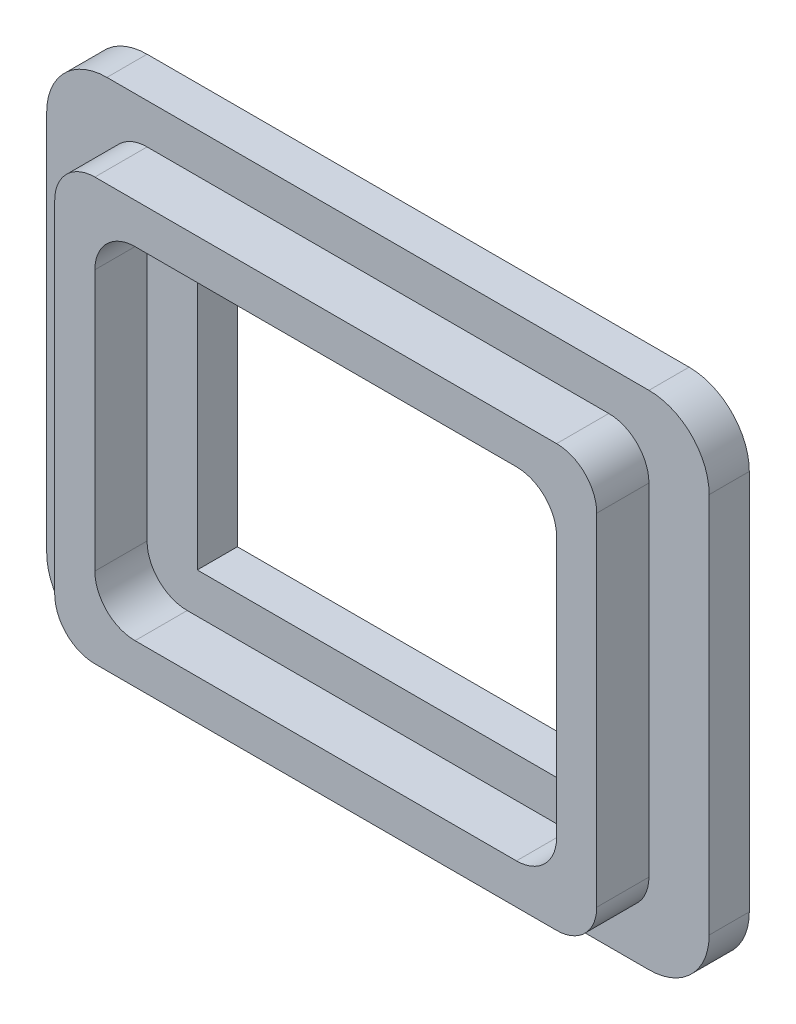
ISO-10303-21;
HEADER;
FILE_DESCRIPTION(('STEP AP214'),'2;1');
FILE_NAME('part.step','',(''),(''),'','','');
FILE_SCHEMA(('AUTOMOTIVE_DESIGN { 1 0 10303 214 1 1 1 1 }'));
ENDSEC;
DATA;
#1=APPLICATION_CONTEXT('core data for automotive mechanical design processes');
#2=APPLICATION_PROTOCOL_DEFINITION('international standard','automotive_design',2000,#1);
#3=PRODUCT_CONTEXT('',#1,'mechanical');
#4=PRODUCT('Part','Part','',(#3));
#5=PRODUCT_RELATED_PRODUCT_CATEGORY('part','',(#4));
#6=PRODUCT_DEFINITION_FORMATION('','',#4);
#7=PRODUCT_DEFINITION_CONTEXT('part definition',#1,'design');
#8=PRODUCT_DEFINITION('design','',#6,#7);
#9=PRODUCT_DEFINITION_SHAPE('','',#8);
#10=(LENGTH_UNIT() NAMED_UNIT(*) SI_UNIT(.MILLI.,.METRE.));
#11=(NAMED_UNIT(*) PLANE_ANGLE_UNIT() SI_UNIT($,.RADIAN.));
#12=(NAMED_UNIT(*) SI_UNIT($,.STERADIAN.) SOLID_ANGLE_UNIT());
#13=UNCERTAINTY_MEASURE_WITH_UNIT(LENGTH_MEASURE(1.E-05),#10,'distance_accuracy_value','');
#14=(GEOMETRIC_REPRESENTATION_CONTEXT(3) GLOBAL_UNCERTAINTY_ASSIGNED_CONTEXT((#13)) GLOBAL_UNIT_ASSIGNED_CONTEXT((#10,
#11,#12)) REPRESENTATION_CONTEXT('',''));
#15=CARTESIAN_POINT('',(0.,0.,0.));
#16=DIRECTION('',(0.,0.,1.));
#17=DIRECTION('',(1.,0.,0.));
#18=AXIS2_PLACEMENT_3D('',#15,#16,#17);
#19=CARTESIAN_POINT('',(13.5,9.5,2.));
#20=DIRECTION('',(0.,0.,-1.));
#21=DIRECTION('',(-1.,0.,0.));
#22=AXIS2_PLACEMENT_3D('',#19,#20,#21);
#23=PLANE('',#22);
#24=DIRECTION('',(0.,1.,0.));
#25=VECTOR('',#24,1.);
#26=CARTESIAN_POINT('',(11.5,6.49999999999999,2.));
#27=LINE('',#26,#25);
#28=CARTESIAN_POINT('',(11.5,-6.49999999999998,2.));
#29=VERTEX_POINT('',#28);
#30=CARTESIAN_POINT('',(11.5,6.49999999999999,2.));
#31=VERTEX_POINT('',#30);
#32=EDGE_CURVE('E264',#29,#31,#27,.T.);
#33=ORIENTED_EDGE('',*,*,#32,.T.);
#34=CARTESIAN_POINT('',(9.5,6.5,2.));
#35=DIRECTION('',(0.,0.,1.));
#36=DIRECTION('',(-1.,0.,0.));
#37=AXIS2_PLACEMENT_3D('',#34,#35,#36);
#38=CIRCLE('',#37,2.);
#39=CARTESIAN_POINT('',(9.49999999999998,8.5,2.));
#40=VERTEX_POINT('',#39);
#41=EDGE_CURVE('E254',#31,#40,#38,.T.);
#42=ORIENTED_EDGE('',*,*,#41,.T.);
#43=DIRECTION('',(-1.,0.,0.));
#44=VECTOR('',#43,1.);
#45=CARTESIAN_POINT('',(-9.49999999999999,8.5,2.));
#46=LINE('',#45,#44);
#47=CARTESIAN_POINT('',(-9.49999999999999,8.5,2.));
#48=VERTEX_POINT('',#47);
#49=EDGE_CURVE('E290',#40,#48,#46,.T.);
#50=ORIENTED_EDGE('',*,*,#49,.T.);
#51=CARTESIAN_POINT('',(-9.5,6.5,2.));
#52=DIRECTION('',(0.,0.,1.));
#53=DIRECTION('',(-1.,0.,0.));
#54=AXIS2_PLACEMENT_3D('',#51,#52,#53);
#55=CIRCLE('',#54,2.);
#56=CARTESIAN_POINT('',(-11.5,6.49999999999999,2.));
#57=VERTEX_POINT('',#56);
#58=EDGE_CURVE('E294',#48,#57,#55,.T.);
#59=ORIENTED_EDGE('',*,*,#58,.T.);
#60=DIRECTION('',(0.,-1.,0.));
#61=VECTOR('',#60,1.);
#62=CARTESIAN_POINT('',(-11.5,6.49999999999999,2.));
#63=LINE('',#62,#61);
#64=CARTESIAN_POINT('',(-11.5,-6.49999999999998,2.));
#65=VERTEX_POINT('',#64);
#66=EDGE_CURVE('E298',#57,#65,#63,.T.);
#67=ORIENTED_EDGE('',*,*,#66,.T.);
#68=CARTESIAN_POINT('',(-9.5,-6.5,2.));
#69=DIRECTION('',(0.,0.,1.));
#70=DIRECTION('',(-1.,0.,0.));
#71=AXIS2_PLACEMENT_3D('',#68,#69,#70);
#72=CIRCLE('',#71,2.);
#73=CARTESIAN_POINT('',(-9.49999999999999,-8.5,2.));
#74=VERTEX_POINT('',#73);
#75=EDGE_CURVE('E302',#65,#74,#72,.T.);
#76=ORIENTED_EDGE('',*,*,#75,.T.);
#77=DIRECTION('',(1.,0.,0.));
#78=VECTOR('',#77,1.);
#79=CARTESIAN_POINT('',(-9.49999999999999,-8.5,2.));
#80=LINE('',#79,#78);
#81=CARTESIAN_POINT('',(9.49999999999998,-8.5,2.));
#82=VERTEX_POINT('',#81);
#83=EDGE_CURVE('E306',#74,#82,#80,.T.);
#84=ORIENTED_EDGE('',*,*,#83,.T.);
#85=CARTESIAN_POINT('',(9.5,-6.5,2.));
#86=DIRECTION('',(0.,0.,1.));
#87=DIRECTION('',(-1.,0.,0.));
#88=AXIS2_PLACEMENT_3D('',#85,#86,#87);
#89=CIRCLE('',#88,2.);
#90=EDGE_CURVE('E310',#82,#29,#89,.T.);
#91=ORIENTED_EDGE('',*,*,#90,.T.);
#92=EDGE_LOOP('',(#33,#42,#50,#59,#67,#76,#84,#91));
#93=FACE_BOUND('',#92,.T.);
#94=DIRECTION('',(0.,1.,0.));
#95=VECTOR('',#94,1.);
#96=CARTESIAN_POINT('',(9.,6.5,2.));
#97=LINE('',#96,#95);
#98=CARTESIAN_POINT('',(9.,-6.5,2.));
#99=VERTEX_POINT('',#98);
#100=CARTESIAN_POINT('',(9.,6.5,2.));
#101=VERTEX_POINT('',#100);
#102=EDGE_CURVE('E236',#99,#101,#97,.T.);
#103=ORIENTED_EDGE('',*,*,#102,.F.);
#104=DIRECTION('',(1.,0.,0.));
#105=VECTOR('',#104,1.);
#106=CARTESIAN_POINT('',(-9.,-6.5,2.));
#107=LINE('',#106,#105);
#108=CARTESIAN_POINT('',(-9.,-6.5,2.));
#109=VERTEX_POINT('',#108);
#110=EDGE_CURVE('E233',#109,#99,#107,.T.);
#111=ORIENTED_EDGE('',*,*,#110,.F.);
#112=DIRECTION('',(0.,-1.,0.));
#113=VECTOR('',#112,1.);
#114=CARTESIAN_POINT('',(-9.,6.5,2.));
#115=LINE('',#114,#113);
#116=CARTESIAN_POINT('',(-9.,6.5,2.));
#117=VERTEX_POINT('',#116);
#118=EDGE_CURVE('E55',#117,#109,#115,.T.);
#119=ORIENTED_EDGE('',*,*,#118,.F.);
#120=DIRECTION('',(-1.,0.,0.));
#121=VECTOR('',#120,1.);
#122=CARTESIAN_POINT('',(-9.,6.5,2.));
#123=LINE('',#122,#121);
#124=EDGE_CURVE('E227',#101,#117,#123,.T.);
#125=ORIENTED_EDGE('',*,*,#124,.F.);
#126=EDGE_LOOP('',(#103,#111,#119,#125));
#127=FACE_BOUND('',#126,.T.);
#128=ADVANCED_FACE('F39',(#93,#127),#23,.F.);
#129=CARTESIAN_POINT('',(13.5,9.5,2.));
#130=DIRECTION('',(0.,0.,1.));
#131=DIRECTION('',(-1.,0.,0.));
#132=AXIS2_PLACEMENT_3D('',#129,#130,#131);
#133=CIRCLE('',#132,3.);
#134=CARTESIAN_POINT('',(16.5,9.49999999999998,2.));
#135=VERTEX_POINT('',#134);
#136=CARTESIAN_POINT('',(13.5,12.5,2.));
#137=VERTEX_POINT('',#136);
#138=EDGE_CURVE('E431',#135,#137,#133,.T.);
#139=ORIENTED_EDGE('',*,*,#138,.T.);
#140=DIRECTION('',(-1.,0.,0.));
#141=VECTOR('',#140,1.);
#142=CARTESIAN_POINT('',(-13.5,12.5,2.));
#143=LINE('',#142,#141);
#144=CARTESIAN_POINT('',(-13.5,12.5,2.));
#145=VERTEX_POINT('',#144);
#146=EDGE_CURVE('E435',#137,#145,#143,.T.);
#147=ORIENTED_EDGE('',*,*,#146,.T.);
#148=CARTESIAN_POINT('',(-13.5,9.5,2.));
#149=DIRECTION('',(0.,0.,1.));
#150=DIRECTION('',(-1.,0.,0.));
#151=AXIS2_PLACEMENT_3D('',#148,#149,#150);
#152=CIRCLE('',#151,3.);
#153=CARTESIAN_POINT('',(-16.5,9.49999999999998,2.));
#154=VERTEX_POINT('',#153);
#155=EDGE_CURVE('E439',#145,#154,#152,.T.);
#156=ORIENTED_EDGE('',*,*,#155,.T.);
#157=DIRECTION('',(0.,-1.,0.));
#158=VECTOR('',#157,1.);
#159=CARTESIAN_POINT('',(-16.5,9.49999999999998,2.));
#160=LINE('',#159,#158);
#161=CARTESIAN_POINT('',(-16.5,-9.49999999999998,2.));
#162=VERTEX_POINT('',#161);
#163=EDGE_CURVE('E442',#154,#162,#160,.T.);
#164=ORIENTED_EDGE('',*,*,#163,.T.);
#165=CARTESIAN_POINT('',(-13.5,-9.5,2.));
#166=DIRECTION('',(0.,0.,1.));
#167=DIRECTION('',(-1.,0.,0.));
#168=AXIS2_PLACEMENT_3D('',#165,#166,#167);
#169=CIRCLE('',#168,3.);
#170=CARTESIAN_POINT('',(-13.5,-12.5,2.));
#171=VERTEX_POINT('',#170);
#172=EDGE_CURVE('E445',#162,#171,#169,.T.);
#173=ORIENTED_EDGE('',*,*,#172,.T.);
#174=DIRECTION('',(1.,0.,0.));
#175=VECTOR('',#174,1.);
#176=CARTESIAN_POINT('',(-13.5,-12.5,2.));
#177=LINE('',#176,#175);
#178=CARTESIAN_POINT('',(13.5,-12.5,2.));
#179=VERTEX_POINT('',#178);
#180=EDGE_CURVE('E448',#171,#179,#177,.T.);
#181=ORIENTED_EDGE('',*,*,#180,.T.);
#182=CARTESIAN_POINT('',(13.5,-9.5,2.));
#183=DIRECTION('',(0.,0.,1.));
#184=DIRECTION('',(-1.,0.,0.));
#185=AXIS2_PLACEMENT_3D('',#182,#183,#184);
#186=CIRCLE('',#185,3.);
#187=CARTESIAN_POINT('',(16.5,-9.49999999999998,2.));
#188=VERTEX_POINT('',#187);
#189=EDGE_CURVE('E451',#179,#188,#186,.T.);
#190=ORIENTED_EDGE('',*,*,#189,.T.);
#191=DIRECTION('',(0.,1.,0.));
#192=VECTOR('',#191,1.);
#193=CARTESIAN_POINT('',(16.5,9.49999999999998,2.));
#194=LINE('',#193,#192);
#195=EDGE_CURVE('E454',#188,#135,#194,.T.);
#196=ORIENTED_EDGE('',*,*,#195,.T.);
#197=EDGE_LOOP('',(#139,#147,#156,#164,#173,#181,#190,#196));
#198=FACE_BOUND('',#197,.T.);
#199=CARTESIAN_POINT('',(11.5,8.5,2.));
#200=DIRECTION('',(0.,0.,1.));
#201=DIRECTION('',(-1.,0.,0.));
#202=AXIS2_PLACEMENT_3D('',#199,#200,#201);
#203=CIRCLE('',#202,2.);
#204=CARTESIAN_POINT('',(13.5,8.49999999999999,2.));
#205=VERTEX_POINT('',#204);
#206=CARTESIAN_POINT('',(11.5,10.5,2.));
#207=VERTEX_POINT('',#206);
#208=EDGE_CURVE('E341',#205,#207,#203,.T.);
#209=ORIENTED_EDGE('',*,*,#208,.F.);
#210=DIRECTION('',(0.,1.,0.));
#211=VECTOR('',#210,1.);
#212=CARTESIAN_POINT('',(13.5,8.49999999999999,2.));
#213=LINE('',#212,#211);
#214=CARTESIAN_POINT('',(13.5,-8.49999999999998,2.));
#215=VERTEX_POINT('',#214);
#216=EDGE_CURVE('E347',#215,#205,#213,.T.);
#217=ORIENTED_EDGE('',*,*,#216,.F.);
#218=CARTESIAN_POINT('',(11.5,-8.5,2.));
#219=DIRECTION('',(0.,0.,1.));
#220=DIRECTION('',(-1.,0.,0.));
#221=AXIS2_PLACEMENT_3D('',#218,#219,#220);
#222=CIRCLE('',#221,2.);
#223=CARTESIAN_POINT('',(11.5,-10.5,2.));
#224=VERTEX_POINT('',#223);
#225=EDGE_CURVE('E392',#224,#215,#222,.T.);
#226=ORIENTED_EDGE('',*,*,#225,.F.);
#227=DIRECTION('',(1.,0.,0.));
#228=VECTOR('',#227,1.);
#229=CARTESIAN_POINT('',(-11.5,-10.5,2.));
#230=LINE('',#229,#228);
#231=CARTESIAN_POINT('',(-11.5,-10.5,2.));
#232=VERTEX_POINT('',#231);
#233=EDGE_CURVE('E388',#232,#224,#230,.T.);
#234=ORIENTED_EDGE('',*,*,#233,.F.);
#235=CARTESIAN_POINT('',(-11.5,-8.5,2.));
#236=DIRECTION('',(0.,0.,1.));
#237=DIRECTION('',(-1.,0.,0.));
#238=AXIS2_PLACEMENT_3D('',#235,#236,#237);
#239=CIRCLE('',#238,2.);
#240=CARTESIAN_POINT('',(-13.5,-8.5,2.));
#241=VERTEX_POINT('',#240);
#242=EDGE_CURVE('E384',#241,#232,#239,.T.);
#243=ORIENTED_EDGE('',*,*,#242,.F.);
#244=DIRECTION('',(0.,-1.,0.));
#245=VECTOR('',#244,1.);
#246=CARTESIAN_POINT('',(-13.5,8.49999999999999,2.));
#247=LINE('',#246,#245);
#248=CARTESIAN_POINT('',(-13.5,8.49999999999999,2.));
#249=VERTEX_POINT('',#248);
#250=EDGE_CURVE('E380',#249,#241,#247,.T.);
#251=ORIENTED_EDGE('',*,*,#250,.F.);
#252=CARTESIAN_POINT('',(-11.5,8.5,2.));
#253=DIRECTION('',(0.,0.,1.));
#254=DIRECTION('',(-1.,0.,0.));
#255=AXIS2_PLACEMENT_3D('',#252,#253,#254);
#256=CIRCLE('',#255,2.);
#257=CARTESIAN_POINT('',(-11.5,10.5,2.));
#258=VERTEX_POINT('',#257);
#259=EDGE_CURVE('E376',#258,#249,#256,.T.);
#260=ORIENTED_EDGE('',*,*,#259,.F.);
#261=DIRECTION('',(-1.,0.,0.));
#262=VECTOR('',#261,1.);
#263=CARTESIAN_POINT('',(-11.5,10.5,2.));
#264=LINE('',#263,#262);
#265=EDGE_CURVE('E372',#207,#258,#264,.T.);
#266=ORIENTED_EDGE('',*,*,#265,.F.);
#267=EDGE_LOOP('',(#209,#217,#226,#234,#243,#251,#260,#266));
#268=FACE_BOUND('',#267,.T.);
#269=ADVANCED_FACE('F566',(#198,#268),#23,.F.);
#270=CARTESIAN_POINT('',(13.5,9.5,2.));
#271=DIRECTION('',(0.,0.,-1.));
#272=DIRECTION('',(-1.,0.,0.));
#273=AXIS2_PLACEMENT_3D('',#270,#271,#272);
#274=CYLINDRICAL_SURFACE('',#273,3.);
#275=CARTESIAN_POINT('',(13.5,9.5,0.));
#276=DIRECTION('',(0.,0.,1.));
#277=DIRECTION('',(-1.,0.,0.));
#278=AXIS2_PLACEMENT_3D('',#275,#276,#277);
#279=CIRCLE('',#278,3.);
#280=CARTESIAN_POINT('',(16.5,9.49999999999998,0.));
#281=VERTEX_POINT('',#280);
#282=CARTESIAN_POINT('',(13.5,12.5,0.));
#283=VERTEX_POINT('',#282);
#284=EDGE_CURVE('E430',#281,#283,#279,.T.);
#285=ORIENTED_EDGE('',*,*,#284,.T.);
#286=DIRECTION('',(0.,0.,-1.));
#287=VECTOR('',#286,1.);
#288=CARTESIAN_POINT('',(13.5,12.5,2.));
#289=LINE('',#288,#287);
#290=EDGE_CURVE('E508',#137,#283,#289,.T.);
#291=ORIENTED_EDGE('',*,*,#290,.F.);
#292=ORIENTED_EDGE('',*,*,#138,.F.);
#293=DIRECTION('',(0.,0.,-1.));
#294=VECTOR('',#293,1.);
#295=CARTESIAN_POINT('',(16.5,9.49999999999998,2.));
#296=LINE('',#295,#294);
#297=EDGE_CURVE('E457',#135,#281,#296,.T.);
#298=ORIENTED_EDGE('',*,*,#297,.T.);
#299=EDGE_LOOP('',(#285,#291,#292,#298));
#300=FACE_BOUND('',#299,.T.);
#301=ADVANCED_FACE('F41',(#300),#274,.T.);
#302=CARTESIAN_POINT('',(-13.5,12.5,2.));
#303=DIRECTION('',(0.,-1.,0.));
#304=DIRECTION('',(0.,0.,-1.));
#305=AXIS2_PLACEMENT_3D('',#302,#303,#304);
#306=PLANE('',#305);
#307=DIRECTION('',(-1.,0.,0.));
#308=VECTOR('',#307,1.);
#309=CARTESIAN_POINT('',(-13.5,12.5,0.));
#310=LINE('',#309,#308);
#311=CARTESIAN_POINT('',(-13.5,12.5,0.));
#312=VERTEX_POINT('',#311);
#313=EDGE_CURVE('E461',#283,#312,#310,.T.);
#314=ORIENTED_EDGE('',*,*,#313,.T.);
#315=DIRECTION('',(0.,0.,-1.));
#316=VECTOR('',#315,1.);
#317=CARTESIAN_POINT('',(-13.5,12.5,2.));
#318=LINE('',#317,#316);
#319=EDGE_CURVE('E504',#145,#312,#318,.T.);
#320=ORIENTED_EDGE('',*,*,#319,.F.);
#321=ORIENTED_EDGE('',*,*,#146,.F.);
#322=ORIENTED_EDGE('',*,*,#290,.T.);
#323=EDGE_LOOP('',(#314,#320,#321,#322));
#324=FACE_BOUND('',#323,.T.);
#325=ADVANCED_FACE('F564',(#324),#306,.F.);
#326=CARTESIAN_POINT('',(-13.5,9.5,2.));
#327=DIRECTION('',(0.,0.,-1.));
#328=DIRECTION('',(-1.,0.,0.));
#329=AXIS2_PLACEMENT_3D('',#326,#327,#328);
#330=CYLINDRICAL_SURFACE('',#329,3.);
#331=CARTESIAN_POINT('',(-13.5,9.5,0.));
#332=DIRECTION('',(0.,0.,1.));
#333=DIRECTION('',(-1.,0.,0.));
#334=AXIS2_PLACEMENT_3D('',#331,#332,#333);
#335=CIRCLE('',#334,3.);
#336=CARTESIAN_POINT('',(-16.5,9.49999999999998,0.));
#337=VERTEX_POINT('',#336);
#338=EDGE_CURVE('E464',#312,#337,#335,.T.);
#339=ORIENTED_EDGE('',*,*,#338,.T.);
#340=DIRECTION('',(0.,0.,-1.));
#341=VECTOR('',#340,1.);
#342=CARTESIAN_POINT('',(-16.5,9.49999999999998,2.));
#343=LINE('',#342,#341);
#344=EDGE_CURVE('E500',#154,#337,#343,.T.);
#345=ORIENTED_EDGE('',*,*,#344,.F.);
#346=ORIENTED_EDGE('',*,*,#155,.F.);
#347=ORIENTED_EDGE('',*,*,#319,.T.);
#348=EDGE_LOOP('',(#339,#345,#346,#347));
#349=FACE_BOUND('',#348,.T.);
#350=ADVANCED_FACE('F560',(#349),#330,.T.);
#351=CARTESIAN_POINT('',(-16.5,9.49999999999998,2.));
#352=DIRECTION('',(1.,0.,0.));
#353=DIRECTION('',(0.,1.,0.));
#354=AXIS2_PLACEMENT_3D('',#351,#352,#353);
#355=PLANE('',#354);
#356=DIRECTION('',(0.,-1.,0.));
#357=VECTOR('',#356,1.);
#358=CARTESIAN_POINT('',(-16.5,9.49999999999998,0.));
#359=LINE('',#358,#357);
#360=CARTESIAN_POINT('',(-16.5,-9.49999999999998,0.));
#361=VERTEX_POINT('',#360);
#362=EDGE_CURVE('E467',#337,#361,#359,.T.);
#363=ORIENTED_EDGE('',*,*,#362,.T.);
#364=DIRECTION('',(0.,0.,-1.));
#365=VECTOR('',#364,1.);
#366=CARTESIAN_POINT('',(-16.5,-9.49999999999998,2.));
#367=LINE('',#366,#365);
#368=EDGE_CURVE('E496',#162,#361,#367,.T.);
#369=ORIENTED_EDGE('',*,*,#368,.F.);
#370=ORIENTED_EDGE('',*,*,#163,.F.);
#371=ORIENTED_EDGE('',*,*,#344,.T.);
#372=EDGE_LOOP('',(#363,#369,#370,#371));
#373=FACE_BOUND('',#372,.T.);
#374=ADVANCED_FACE('F557',(#373),#355,.F.);
#375=CARTESIAN_POINT('',(-13.5,-9.5,2.));
#376=DIRECTION('',(0.,0.,-1.));
#377=DIRECTION('',(-1.,0.,0.));
#378=AXIS2_PLACEMENT_3D('',#375,#376,#377);
#379=CYLINDRICAL_SURFACE('',#378,3.);
#380=CARTESIAN_POINT('',(-13.5,-9.5,0.));
#381=DIRECTION('',(0.,0.,1.));
#382=DIRECTION('',(-1.,0.,0.));
#383=AXIS2_PLACEMENT_3D('',#380,#381,#382);
#384=CIRCLE('',#383,3.);
#385=CARTESIAN_POINT('',(-13.5,-12.5,0.));
#386=VERTEX_POINT('',#385);
#387=EDGE_CURVE('E470',#361,#386,#384,.T.);
#388=ORIENTED_EDGE('',*,*,#387,.T.);
#389=DIRECTION('',(0.,0.,-1.));
#390=VECTOR('',#389,1.);
#391=CARTESIAN_POINT('',(-13.5,-12.5,2.));
#392=LINE('',#391,#390);
#393=EDGE_CURVE('E492',#171,#386,#392,.T.);
#394=ORIENTED_EDGE('',*,*,#393,.F.);
#395=ORIENTED_EDGE('',*,*,#172,.F.);
#396=ORIENTED_EDGE('',*,*,#368,.T.);
#397=EDGE_LOOP('',(#388,#394,#395,#396));
#398=FACE_BOUND('',#397,.T.);
#399=ADVANCED_FACE('F553',(#398),#379,.T.);
#400=CARTESIAN_POINT('',(-13.5,-12.5,2.));
#401=DIRECTION('',(0.,1.,0.));
#402=DIRECTION('',(0.,0.,1.));
#403=AXIS2_PLACEMENT_3D('',#400,#401,#402);
#404=PLANE('',#403);
#405=DIRECTION('',(1.,0.,0.));
#406=VECTOR('',#405,1.);
#407=CARTESIAN_POINT('',(-13.5,-12.5,0.));
#408=LINE('',#407,#406);
#409=CARTESIAN_POINT('',(13.5,-12.5,0.));
#410=VERTEX_POINT('',#409);
#411=EDGE_CURVE('E473',#386,#410,#408,.T.);
#412=ORIENTED_EDGE('',*,*,#411,.T.);
#413=DIRECTION('',(0.,0.,-1.));
#414=VECTOR('',#413,1.);
#415=CARTESIAN_POINT('',(13.5,-12.5,2.));
#416=LINE('',#415,#414);
#417=EDGE_CURVE('E488',#179,#410,#416,.T.);
#418=ORIENTED_EDGE('',*,*,#417,.F.);
#419=ORIENTED_EDGE('',*,*,#180,.F.);
#420=ORIENTED_EDGE('',*,*,#393,.T.);
#421=EDGE_LOOP('',(#412,#418,#419,#420));
#422=FACE_BOUND('',#421,.T.);
#423=ADVANCED_FACE('F548',(#422),#404,.F.);
#424=CARTESIAN_POINT('',(13.5,-9.5,2.));
#425=DIRECTION('',(0.,0.,-1.));
#426=DIRECTION('',(-1.,0.,0.));
#427=AXIS2_PLACEMENT_3D('',#424,#425,#426);
#428=CYLINDRICAL_SURFACE('',#427,3.);
#429=CARTESIAN_POINT('',(13.5,-9.5,0.));
#430=DIRECTION('',(0.,0.,1.));
#431=DIRECTION('',(-1.,0.,0.));
#432=AXIS2_PLACEMENT_3D('',#429,#430,#431);
#433=CIRCLE('',#432,3.);
#434=CARTESIAN_POINT('',(16.5,-9.49999999999998,0.));
#435=VERTEX_POINT('',#434);
#436=EDGE_CURVE('E476',#410,#435,#433,.T.);
#437=ORIENTED_EDGE('',*,*,#436,.T.);
#438=DIRECTION('',(0.,0.,-1.));
#439=VECTOR('',#438,1.);
#440=CARTESIAN_POINT('',(16.5,-9.49999999999998,2.));
#441=LINE('',#440,#439);
#442=EDGE_CURVE('E484',#188,#435,#441,.T.);
#443=ORIENTED_EDGE('',*,*,#442,.F.);
#444=ORIENTED_EDGE('',*,*,#189,.F.);
#445=ORIENTED_EDGE('',*,*,#417,.T.);
#446=EDGE_LOOP('',(#437,#443,#444,#445));
#447=FACE_BOUND('',#446,.T.);
#448=ADVANCED_FACE('F542',(#447),#428,.T.);
#449=CARTESIAN_POINT('',(16.5,9.49999999999998,2.));
#450=DIRECTION('',(-1.,0.,0.));
#451=DIRECTION('',(0.,-1.,0.));
#452=AXIS2_PLACEMENT_3D('',#449,#450,#451);
#453=PLANE('',#452);
#454=DIRECTION('',(0.,1.,0.));
#455=VECTOR('',#454,1.);
#456=CARTESIAN_POINT('',(16.5,9.49999999999998,0.));
#457=LINE('',#456,#455);
#458=EDGE_CURVE('E436',#435,#281,#457,.T.);
#459=ORIENTED_EDGE('',*,*,#458,.T.);
#460=ORIENTED_EDGE('',*,*,#297,.F.);
#461=ORIENTED_EDGE('',*,*,#195,.F.);
#462=ORIENTED_EDGE('',*,*,#442,.T.);
#463=EDGE_LOOP('',(#459,#460,#461,#462));
#464=FACE_BOUND('',#463,.T.);
#465=ADVANCED_FACE('F527',(#464),#453,.F.);
#466=CARTESIAN_POINT('',(13.5,9.5,0.));
#467=DIRECTION('',(0.,0.,-1.));
#468=DIRECTION('',(-1.,0.,0.));
#469=AXIS2_PLACEMENT_3D('',#466,#467,#468);
#470=PLANE('',#469);
#471=DIRECTION('',(0.,-1.,0.));
#472=VECTOR('',#471,1.);
#473=CARTESIAN_POINT('',(9.,9.5,0.));
#474=LINE('',#473,#472);
#475=CARTESIAN_POINT('',(9.,6.5,0.));
#476=VERTEX_POINT('',#475);
#477=CARTESIAN_POINT('',(9.,-6.5,0.));
#478=VERTEX_POINT('',#477);
#479=EDGE_CURVE('E11',#476,#478,#474,.T.);
#480=ORIENTED_EDGE('',*,*,#479,.F.);
#481=DIRECTION('',(1.,0.,0.));
#482=VECTOR('',#481,1.);
#483=CARTESIAN_POINT('',(13.5,6.5,0.));
#484=LINE('',#483,#482);
#485=CARTESIAN_POINT('',(-9.,6.5,0.));
#486=VERTEX_POINT('',#485);
#487=EDGE_CURVE('E229',#486,#476,#484,.T.);
#488=ORIENTED_EDGE('',*,*,#487,.F.);
#489=DIRECTION('',(0.,1.,0.));
#490=VECTOR('',#489,1.);
#491=CARTESIAN_POINT('',(-9.,9.5,0.));
#492=LINE('',#491,#490);
#493=CARTESIAN_POINT('',(-9.,-6.5,0.));
#494=VERTEX_POINT('',#493);
#495=EDGE_CURVE('E514',#494,#486,#492,.T.);
#496=ORIENTED_EDGE('',*,*,#495,.F.);
#497=DIRECTION('',(-1.,0.,0.));
#498=VECTOR('',#497,1.);
#499=CARTESIAN_POINT('',(13.5,-6.5,0.));
#500=LINE('',#499,#498);
#501=EDGE_CURVE('E48',#478,#494,#500,.T.);
#502=ORIENTED_EDGE('',*,*,#501,.F.);
#503=EDGE_LOOP('',(#480,#488,#496,#502));
#504=FACE_BOUND('',#503,.T.);
#505=ORIENTED_EDGE('',*,*,#284,.F.);
#506=ORIENTED_EDGE('',*,*,#458,.F.);
#507=ORIENTED_EDGE('',*,*,#436,.F.);
#508=ORIENTED_EDGE('',*,*,#411,.F.);
#509=ORIENTED_EDGE('',*,*,#387,.F.);
#510=ORIENTED_EDGE('',*,*,#362,.F.);
#511=ORIENTED_EDGE('',*,*,#338,.F.);
#512=ORIENTED_EDGE('',*,*,#313,.F.);
#513=EDGE_LOOP('',(#505,#506,#507,#508,#509,#510,#511,#512));
#514=FACE_BOUND('',#513,.T.);
#515=ADVANCED_FACE('F523',(#504,#514),#470,.T.);
#516=CARTESIAN_POINT('',(11.5,8.5,4.6));
#517=DIRECTION('',(0.,0.,-1.));
#518=DIRECTION('',(-1.,0.,0.));
#519=AXIS2_PLACEMENT_3D('',#516,#517,#518);
#520=PLANE('',#519);
#521=CARTESIAN_POINT('',(11.5,8.5,4.6));
#522=DIRECTION('',(0.,0.,1.));
#523=DIRECTION('',(-1.,0.,0.));
#524=AXIS2_PLACEMENT_3D('',#521,#522,#523);
#525=CIRCLE('',#524,2.);
#526=CARTESIAN_POINT('',(13.5,8.49999999999999,4.6));
#527=VERTEX_POINT('',#526);
#528=CARTESIAN_POINT('',(11.5,10.5,4.6));
#529=VERTEX_POINT('',#528);
#530=EDGE_CURVE('E342',#527,#529,#525,.T.);
#531=ORIENTED_EDGE('',*,*,#530,.T.);
#532=DIRECTION('',(-1.,0.,0.));
#533=VECTOR('',#532,1.);
#534=CARTESIAN_POINT('',(-11.5,10.5,4.6));
#535=LINE('',#534,#533);
#536=CARTESIAN_POINT('',(-11.5,10.5,4.6));
#537=VERTEX_POINT('',#536);
#538=EDGE_CURVE('E346',#529,#537,#535,.T.);
#539=ORIENTED_EDGE('',*,*,#538,.T.);
#540=CARTESIAN_POINT('',(-11.5,8.5,4.6));
#541=DIRECTION('',(0.,0.,1.));
#542=DIRECTION('',(-1.,0.,0.));
#543=AXIS2_PLACEMENT_3D('',#540,#541,#542);
#544=CIRCLE('',#543,2.);
#545=CARTESIAN_POINT('',(-13.5,8.49999999999999,4.6));
#546=VERTEX_POINT('',#545);
#547=EDGE_CURVE('E350',#537,#546,#544,.T.);
#548=ORIENTED_EDGE('',*,*,#547,.T.);
#549=DIRECTION('',(0.,-1.,0.));
#550=VECTOR('',#549,1.);
#551=CARTESIAN_POINT('',(-13.5,8.49999999999999,4.6));
#552=LINE('',#551,#550);
#553=CARTESIAN_POINT('',(-13.5,-8.49999999999999,4.6));
#554=VERTEX_POINT('',#553);
#555=EDGE_CURVE('E353',#546,#554,#552,.T.);
#556=ORIENTED_EDGE('',*,*,#555,.T.);
#557=CARTESIAN_POINT('',(-11.5,-8.5,4.6));
#558=DIRECTION('',(0.,0.,1.));
#559=DIRECTION('',(-1.,0.,0.));
#560=AXIS2_PLACEMENT_3D('',#557,#558,#559);
#561=CIRCLE('',#560,2.);
#562=CARTESIAN_POINT('',(-11.5,-10.5,4.6));
#563=VERTEX_POINT('',#562);
#564=EDGE_CURVE('E356',#554,#563,#561,.T.);
#565=ORIENTED_EDGE('',*,*,#564,.T.);
#566=DIRECTION('',(1.,0.,0.));
#567=VECTOR('',#566,1.);
#568=CARTESIAN_POINT('',(-11.5,-10.5,4.6));
#569=LINE('',#568,#567);
#570=CARTESIAN_POINT('',(11.5,-10.5,4.6));
#571=VERTEX_POINT('',#570);
#572=EDGE_CURVE('E359',#563,#571,#569,.T.);
#573=ORIENTED_EDGE('',*,*,#572,.T.);
#574=CARTESIAN_POINT('',(11.5,-8.5,4.6));
#575=DIRECTION('',(0.,0.,1.));
#576=DIRECTION('',(-1.,0.,0.));
#577=AXIS2_PLACEMENT_3D('',#574,#575,#576);
#578=CIRCLE('',#577,2.);
#579=CARTESIAN_POINT('',(13.5,-8.49999999999998,4.6));
#580=VERTEX_POINT('',#579);
#581=EDGE_CURVE('E362',#571,#580,#578,.T.);
#582=ORIENTED_EDGE('',*,*,#581,.T.);
#583=DIRECTION('',(0.,1.,0.));
#584=VECTOR('',#583,1.);
#585=CARTESIAN_POINT('',(13.5,8.49999999999999,4.6));
#586=LINE('',#585,#584);
#587=EDGE_CURVE('E365',#580,#527,#586,.T.);
#588=ORIENTED_EDGE('',*,*,#587,.T.);
#589=EDGE_LOOP('',(#531,#539,#548,#556,#565,#573,#582,#588));
#590=FACE_BOUND('',#589,.T.);
#591=CARTESIAN_POINT('',(9.5,6.5,4.6));
#592=DIRECTION('',(0.,0.,1.));
#593=DIRECTION('',(-1.,0.,0.));
#594=AXIS2_PLACEMENT_3D('',#591,#592,#593);
#595=CIRCLE('',#594,2.);
#596=CARTESIAN_POINT('',(11.5,6.49999999999999,4.6));
#597=VERTEX_POINT('',#596);
#598=CARTESIAN_POINT('',(9.49999999999998,8.5,4.6));
#599=VERTEX_POINT('',#598);
#600=EDGE_CURVE('E260',#597,#599,#595,.T.);
#601=ORIENTED_EDGE('',*,*,#600,.F.);
#602=DIRECTION('',(0.,1.,0.));
#603=VECTOR('',#602,1.);
#604=CARTESIAN_POINT('',(11.5,6.49999999999999,4.6));
#605=LINE('',#604,#603);
#606=CARTESIAN_POINT('',(11.5,-6.49999999999998,4.6));
#607=VERTEX_POINT('',#606);
#608=EDGE_CURVE('E283',#607,#597,#605,.T.);
#609=ORIENTED_EDGE('',*,*,#608,.F.);
#610=CARTESIAN_POINT('',(9.5,-6.5,4.6));
#611=DIRECTION('',(0.,0.,1.));
#612=DIRECTION('',(-1.,0.,0.));
#613=AXIS2_PLACEMENT_3D('',#610,#611,#612);
#614=CIRCLE('',#613,2.);
#615=CARTESIAN_POINT('',(9.49999999999998,-8.5,4.6));
#616=VERTEX_POINT('',#615);
#617=EDGE_CURVE('E279',#616,#607,#614,.T.);
#618=ORIENTED_EDGE('',*,*,#617,.F.);
#619=DIRECTION('',(1.,0.,0.));
#620=VECTOR('',#619,1.);
#621=CARTESIAN_POINT('',(-9.49999999999999,-8.5,4.6));
#622=LINE('',#621,#620);
#623=CARTESIAN_POINT('',(-9.49999999999999,-8.5,4.6));
#624=VERTEX_POINT('',#623);
#625=EDGE_CURVE('E276',#624,#616,#622,.T.);
#626=ORIENTED_EDGE('',*,*,#625,.F.);
#627=CARTESIAN_POINT('',(-9.5,-6.5,4.6));
#628=DIRECTION('',(0.,0.,1.));
#629=DIRECTION('',(-1.,0.,0.));
#630=AXIS2_PLACEMENT_3D('',#627,#628,#629);
#631=CIRCLE('',#630,2.);
#632=CARTESIAN_POINT('',(-11.5,-6.49999999999998,4.6));
#633=VERTEX_POINT('',#632);
#634=EDGE_CURVE('E273',#633,#624,#631,.T.);
#635=ORIENTED_EDGE('',*,*,#634,.F.);
#636=DIRECTION('',(0.,-1.,0.));
#637=VECTOR('',#636,1.);
#638=CARTESIAN_POINT('',(-11.5,6.49999999999999,4.6));
#639=LINE('',#638,#637);
#640=CARTESIAN_POINT('',(-11.5,6.49999999999999,4.6));
#641=VERTEX_POINT('',#640);
#642=EDGE_CURVE('E270',#641,#633,#639,.T.);
#643=ORIENTED_EDGE('',*,*,#642,.F.);
#644=CARTESIAN_POINT('',(-9.5,6.5,4.6));
#645=DIRECTION('',(0.,0.,1.));
#646=DIRECTION('',(-1.,0.,0.));
#647=AXIS2_PLACEMENT_3D('',#644,#645,#646);
#648=CIRCLE('',#647,2.);
#649=CARTESIAN_POINT('',(-9.49999999999999,8.5,4.6));
#650=VERTEX_POINT('',#649);
#651=EDGE_CURVE('E267',#650,#641,#648,.T.);
#652=ORIENTED_EDGE('',*,*,#651,.F.);
#653=DIRECTION('',(-1.,0.,0.));
#654=VECTOR('',#653,1.);
#655=CARTESIAN_POINT('',(-9.49999999999999,8.5,4.6));
#656=LINE('',#655,#654);
#657=EDGE_CURVE('E263',#599,#650,#656,.T.);
#658=ORIENTED_EDGE('',*,*,#657,.F.);
#659=EDGE_LOOP('',(#601,#609,#618,#626,#635,#643,#652,#658));
#660=FACE_BOUND('',#659,.T.);
#661=ADVANCED_FACE('F526',(#590,#660),#520,.F.);
#662=CARTESIAN_POINT('',(11.5,8.5,4.6));
#663=DIRECTION('',(0.,0.,-1.));
#664=DIRECTION('',(-1.,0.,0.));
#665=AXIS2_PLACEMENT_3D('',#662,#663,#664);
#666=CYLINDRICAL_SURFACE('',#665,2.);
#667=ORIENTED_EDGE('',*,*,#208,.T.);
#668=DIRECTION('',(0.,0.,-1.));
#669=VECTOR('',#668,1.);
#670=CARTESIAN_POINT('',(11.5,10.5,4.6));
#671=LINE('',#670,#669);
#672=EDGE_CURVE('E426',#529,#207,#671,.T.);
#673=ORIENTED_EDGE('',*,*,#672,.F.);
#674=ORIENTED_EDGE('',*,*,#530,.F.);
#675=DIRECTION('',(0.,0.,-1.));
#676=VECTOR('',#675,1.);
#677=CARTESIAN_POINT('',(13.5,8.49999999999999,4.6));
#678=LINE('',#677,#676);
#679=EDGE_CURVE('E368',#527,#205,#678,.T.);
#680=ORIENTED_EDGE('',*,*,#679,.T.);
#681=EDGE_LOOP('',(#667,#673,#674,#680));
#682=FACE_BOUND('',#681,.T.);
#683=ADVANCED_FACE('F578',(#682),#666,.T.);
#684=CARTESIAN_POINT('',(-11.5,10.5,4.6));
#685=DIRECTION('',(0.,-1.,0.));
#686=DIRECTION('',(0.,0.,-1.));
#687=AXIS2_PLACEMENT_3D('',#684,#685,#686);
#688=PLANE('',#687);
#689=ORIENTED_EDGE('',*,*,#265,.T.);
#690=DIRECTION('',(0.,0.,-1.));
#691=VECTOR('',#690,1.);
#692=CARTESIAN_POINT('',(-11.5,10.5,4.6));
#693=LINE('',#692,#691);
#694=EDGE_CURVE('E422',#537,#258,#693,.T.);
#695=ORIENTED_EDGE('',*,*,#694,.F.);
#696=ORIENTED_EDGE('',*,*,#538,.F.);
#697=ORIENTED_EDGE('',*,*,#672,.T.);
#698=EDGE_LOOP('',(#689,#695,#696,#697));
#699=FACE_BOUND('',#698,.T.);
#700=ADVANCED_FACE('F602',(#699),#688,.F.);
#701=CARTESIAN_POINT('',(-11.5,8.5,4.6));
#702=DIRECTION('',(0.,0.,-1.));
#703=DIRECTION('',(-1.,0.,0.));
#704=AXIS2_PLACEMENT_3D('',#701,#702,#703);
#705=CYLINDRICAL_SURFACE('',#704,2.);
#706=ORIENTED_EDGE('',*,*,#259,.T.);
#707=DIRECTION('',(0.,0.,-1.));
#708=VECTOR('',#707,1.);
#709=CARTESIAN_POINT('',(-13.5,8.49999999999999,4.6));
#710=LINE('',#709,#708);
#711=EDGE_CURVE('E418',#546,#249,#710,.T.);
#712=ORIENTED_EDGE('',*,*,#711,.F.);
#713=ORIENTED_EDGE('',*,*,#547,.F.);
#714=ORIENTED_EDGE('',*,*,#694,.T.);
#715=EDGE_LOOP('',(#706,#712,#713,#714));
#716=FACE_BOUND('',#715,.T.);
#717=ADVANCED_FACE('F600',(#716),#705,.T.);
#718=CARTESIAN_POINT('',(-13.5,8.49999999999999,4.6));
#719=DIRECTION('',(1.,0.,0.));
#720=DIRECTION('',(0.,1.,0.));
#721=AXIS2_PLACEMENT_3D('',#718,#719,#720);
#722=PLANE('',#721);
#723=ORIENTED_EDGE('',*,*,#250,.T.);
#724=DIRECTION('',(0.,0.,-1.));
#725=VECTOR('',#724,1.);
#726=CARTESIAN_POINT('',(-13.5,-8.49999999999999,4.6));
#727=LINE('',#726,#725);
#728=EDGE_CURVE('E414',#554,#241,#727,.T.);
#729=ORIENTED_EDGE('',*,*,#728,.F.);
#730=ORIENTED_EDGE('',*,*,#555,.F.);
#731=ORIENTED_EDGE('',*,*,#711,.T.);
#732=EDGE_LOOP('',(#723,#729,#730,#731));
#733=FACE_BOUND('',#732,.T.);
#734=ADVANCED_FACE('F595',(#733),#722,.F.);
#735=CARTESIAN_POINT('',(-11.5,-8.5,4.6));
#736=DIRECTION('',(0.,0.,-1.));
#737=DIRECTION('',(-1.,0.,0.));
#738=AXIS2_PLACEMENT_3D('',#735,#736,#737);
#739=CYLINDRICAL_SURFACE('',#738,2.);
#740=ORIENTED_EDGE('',*,*,#242,.T.);
#741=DIRECTION('',(0.,0.,-1.));
#742=VECTOR('',#741,1.);
#743=CARTESIAN_POINT('',(-11.5,-10.5,4.6));
#744=LINE('',#743,#742);
#745=EDGE_CURVE('E410',#563,#232,#744,.T.);
#746=ORIENTED_EDGE('',*,*,#745,.F.);
#747=ORIENTED_EDGE('',*,*,#564,.F.);
#748=ORIENTED_EDGE('',*,*,#728,.T.);
#749=EDGE_LOOP('',(#740,#746,#747,#748));
#750=FACE_BOUND('',#749,.T.);
#751=ADVANCED_FACE('F592',(#750),#739,.T.);
#752=CARTESIAN_POINT('',(-11.5,-10.5,4.6));
#753=DIRECTION('',(0.,1.,0.));
#754=DIRECTION('',(0.,0.,1.));
#755=AXIS2_PLACEMENT_3D('',#752,#753,#754);
#756=PLANE('',#755);
#757=ORIENTED_EDGE('',*,*,#233,.T.);
#758=DIRECTION('',(0.,0.,-1.));
#759=VECTOR('',#758,1.);
#760=CARTESIAN_POINT('',(11.5,-10.5,4.6));
#761=LINE('',#760,#759);
#762=EDGE_CURVE('E406',#571,#224,#761,.T.);
#763=ORIENTED_EDGE('',*,*,#762,.F.);
#764=ORIENTED_EDGE('',*,*,#572,.F.);
#765=ORIENTED_EDGE('',*,*,#745,.T.);
#766=EDGE_LOOP('',(#757,#763,#764,#765));
#767=FACE_BOUND('',#766,.T.);
#768=ADVANCED_FACE('F588',(#767),#756,.F.);
#769=CARTESIAN_POINT('',(11.5,-8.5,4.6));
#770=DIRECTION('',(0.,0.,-1.));
#771=DIRECTION('',(-1.,0.,0.));
#772=AXIS2_PLACEMENT_3D('',#769,#770,#771);
#773=CYLINDRICAL_SURFACE('',#772,2.);
#774=ORIENTED_EDGE('',*,*,#225,.T.);
#775=DIRECTION('',(0.,0.,-1.));
#776=VECTOR('',#775,1.);
#777=CARTESIAN_POINT('',(13.5,-8.49999999999998,4.6));
#778=LINE('',#777,#776);
#779=EDGE_CURVE('E402',#580,#215,#778,.T.);
#780=ORIENTED_EDGE('',*,*,#779,.F.);
#781=ORIENTED_EDGE('',*,*,#581,.F.);
#782=ORIENTED_EDGE('',*,*,#762,.T.);
#783=EDGE_LOOP('',(#774,#780,#781,#782));
#784=FACE_BOUND('',#783,.T.);
#785=ADVANCED_FACE('F586',(#784),#773,.T.);
#786=CARTESIAN_POINT('',(13.5,8.49999999999999,4.6));
#787=DIRECTION('',(-1.,0.,0.));
#788=DIRECTION('',(0.,-1.,0.));
#789=AXIS2_PLACEMENT_3D('',#786,#787,#788);
#790=PLANE('',#789);
#791=ORIENTED_EDGE('',*,*,#216,.T.);
#792=ORIENTED_EDGE('',*,*,#679,.F.);
#793=ORIENTED_EDGE('',*,*,#587,.F.);
#794=ORIENTED_EDGE('',*,*,#779,.T.);
#795=EDGE_LOOP('',(#791,#792,#793,#794));
#796=FACE_BOUND('',#795,.T.);
#797=ADVANCED_FACE('F574',(#796),#790,.F.);
#798=CARTESIAN_POINT('',(9.5,6.5,4.6));
#799=DIRECTION('',(0.,0.,-1.));
#800=DIRECTION('',(-1.,0.,0.));
#801=AXIS2_PLACEMENT_3D('',#798,#799,#800);
#802=CYLINDRICAL_SURFACE('',#801,2.);
#803=ORIENTED_EDGE('',*,*,#41,.F.);
#804=DIRECTION('',(0.,0.,-1.));
#805=VECTOR('',#804,1.);
#806=CARTESIAN_POINT('',(11.5,6.49999999999999,4.6));
#807=LINE('',#806,#805);
#808=EDGE_CURVE('E286',#597,#31,#807,.T.);
#809=ORIENTED_EDGE('',*,*,#808,.F.);
#810=ORIENTED_EDGE('',*,*,#600,.T.);
#811=DIRECTION('',(0.,0.,-1.));
#812=VECTOR('',#811,1.);
#813=CARTESIAN_POINT('',(9.49999999999998,8.5,4.6));
#814=LINE('',#813,#812);
#815=EDGE_CURVE('E337',#599,#40,#814,.T.);
#816=ORIENTED_EDGE('',*,*,#815,.T.);
#817=EDGE_LOOP('',(#803,#809,#810,#816));
#818=FACE_BOUND('',#817,.T.);
#819=ADVANCED_FACE('F707',(#818),#802,.F.);
#820=CARTESIAN_POINT('',(-9.49999999999999,8.5,4.6));
#821=DIRECTION('',(0.,-1.,0.));
#822=DIRECTION('',(0.,0.,-1.));
#823=AXIS2_PLACEMENT_3D('',#820,#821,#822);
#824=PLANE('',#823);
#825=ORIENTED_EDGE('',*,*,#49,.F.);
#826=ORIENTED_EDGE('',*,*,#815,.F.);
#827=ORIENTED_EDGE('',*,*,#657,.T.);
#828=DIRECTION('',(0.,0.,-1.));
#829=VECTOR('',#828,1.);
#830=CARTESIAN_POINT('',(-9.49999999999999,8.5,4.6));
#831=LINE('',#830,#829);
#832=EDGE_CURVE('E334',#650,#48,#831,.T.);
#833=ORIENTED_EDGE('',*,*,#832,.T.);
#834=EDGE_LOOP('',(#825,#826,#827,#833));
#835=FACE_BOUND('',#834,.T.);
#836=ADVANCED_FACE('F716',(#835),#824,.T.);
#837=CARTESIAN_POINT('',(-9.5,6.5,4.6));
#838=DIRECTION('',(0.,0.,-1.));
#839=DIRECTION('',(-1.,0.,0.));
#840=AXIS2_PLACEMENT_3D('',#837,#838,#839);
#841=CYLINDRICAL_SURFACE('',#840,2.);
#842=ORIENTED_EDGE('',*,*,#58,.F.);
#843=ORIENTED_EDGE('',*,*,#832,.F.);
#844=ORIENTED_EDGE('',*,*,#651,.T.);
#845=DIRECTION('',(0.,0.,-1.));
#846=VECTOR('',#845,1.);
#847=CARTESIAN_POINT('',(-11.5,6.49999999999999,4.6));
#848=LINE('',#847,#846);
#849=EDGE_CURVE('E331',#641,#57,#848,.T.);
#850=ORIENTED_EDGE('',*,*,#849,.T.);
#851=EDGE_LOOP('',(#842,#843,#844,#850));
#852=FACE_BOUND('',#851,.T.);
#853=ADVANCED_FACE('F726',(#852),#841,.F.);
#854=CARTESIAN_POINT('',(-11.5,6.49999999999999,4.6));
#855=DIRECTION('',(1.,0.,0.));
#856=DIRECTION('',(0.,1.,0.));
#857=AXIS2_PLACEMENT_3D('',#854,#855,#856);
#858=PLANE('',#857);
#859=ORIENTED_EDGE('',*,*,#66,.F.);
#860=ORIENTED_EDGE('',*,*,#849,.F.);
#861=ORIENTED_EDGE('',*,*,#642,.T.);
#862=DIRECTION('',(0.,0.,-1.));
#863=VECTOR('',#862,1.);
#864=CARTESIAN_POINT('',(-11.5,-6.49999999999998,4.6));
#865=LINE('',#864,#863);
#866=EDGE_CURVE('E328',#633,#65,#865,.T.);
#867=ORIENTED_EDGE('',*,*,#866,.T.);
#868=EDGE_LOOP('',(#859,#860,#861,#867));
#869=FACE_BOUND('',#868,.T.);
#870=ADVANCED_FACE('F736',(#869),#858,.T.);
#871=CARTESIAN_POINT('',(-9.5,-6.5,4.6));
#872=DIRECTION('',(0.,0.,-1.));
#873=DIRECTION('',(-1.,0.,0.));
#874=AXIS2_PLACEMENT_3D('',#871,#872,#873);
#875=CYLINDRICAL_SURFACE('',#874,2.);
#876=ORIENTED_EDGE('',*,*,#75,.F.);
#877=ORIENTED_EDGE('',*,*,#866,.F.);
#878=ORIENTED_EDGE('',*,*,#634,.T.);
#879=DIRECTION('',(0.,0.,-1.));
#880=VECTOR('',#879,1.);
#881=CARTESIAN_POINT('',(-9.49999999999999,-8.5,4.6));
#882=LINE('',#881,#880);
#883=EDGE_CURVE('E325',#624,#74,#882,.T.);
#884=ORIENTED_EDGE('',*,*,#883,.T.);
#885=EDGE_LOOP('',(#876,#877,#878,#884));
#886=FACE_BOUND('',#885,.T.);
#887=ADVANCED_FACE('F746',(#886),#875,.F.);
#888=CARTESIAN_POINT('',(-9.49999999999999,-8.5,4.6));
#889=DIRECTION('',(0.,1.,0.));
#890=DIRECTION('',(0.,0.,1.));
#891=AXIS2_PLACEMENT_3D('',#888,#889,#890);
#892=PLANE('',#891);
#893=ORIENTED_EDGE('',*,*,#83,.F.);
#894=ORIENTED_EDGE('',*,*,#883,.F.);
#895=ORIENTED_EDGE('',*,*,#625,.T.);
#896=DIRECTION('',(0.,0.,-1.));
#897=VECTOR('',#896,1.);
#898=CARTESIAN_POINT('',(9.49999999999998,-8.5,4.6));
#899=LINE('',#898,#897);
#900=EDGE_CURVE('E322',#616,#82,#899,.T.);
#901=ORIENTED_EDGE('',*,*,#900,.T.);
#902=EDGE_LOOP('',(#893,#894,#895,#901));
#903=FACE_BOUND('',#902,.T.);
#904=ADVANCED_FACE('F756',(#903),#892,.T.);
#905=CARTESIAN_POINT('',(9.5,-6.5,4.6));
#906=DIRECTION('',(0.,0.,-1.));
#907=DIRECTION('',(-1.,0.,0.));
#908=AXIS2_PLACEMENT_3D('',#905,#906,#907);
#909=CYLINDRICAL_SURFACE('',#908,2.);
#910=ORIENTED_EDGE('',*,*,#90,.F.);
#911=ORIENTED_EDGE('',*,*,#900,.F.);
#912=ORIENTED_EDGE('',*,*,#617,.T.);
#913=DIRECTION('',(0.,0.,-1.));
#914=VECTOR('',#913,1.);
#915=CARTESIAN_POINT('',(11.5,-6.49999999999998,4.6));
#916=LINE('',#915,#914);
#917=EDGE_CURVE('E319',#607,#29,#916,.T.);
#918=ORIENTED_EDGE('',*,*,#917,.T.);
#919=EDGE_LOOP('',(#910,#911,#912,#918));
#920=FACE_BOUND('',#919,.T.);
#921=ADVANCED_FACE('F766',(#920),#909,.F.);
#922=CARTESIAN_POINT('',(11.5,6.49999999999999,4.6));
#923=DIRECTION('',(-1.,0.,0.));
#924=DIRECTION('',(0.,-1.,0.));
#925=AXIS2_PLACEMENT_3D('',#922,#923,#924);
#926=PLANE('',#925);
#927=ORIENTED_EDGE('',*,*,#32,.F.);
#928=ORIENTED_EDGE('',*,*,#917,.F.);
#929=ORIENTED_EDGE('',*,*,#608,.T.);
#930=ORIENTED_EDGE('',*,*,#808,.T.);
#931=EDGE_LOOP('',(#927,#928,#929,#930));
#932=FACE_BOUND('',#931,.T.);
#933=ADVANCED_FACE('F776',(#932),#926,.T.);
#934=CARTESIAN_POINT('',(9.,6.5,-10.));
#935=DIRECTION('',(1.,0.,0.));
#936=DIRECTION('',(0.,0.,-1.));
#937=AXIS2_PLACEMENT_3D('',#934,#935,#936);
#938=PLANE('',#937);
#939=ORIENTED_EDGE('',*,*,#479,.T.);
#940=DIRECTION('',(0.,0.,1.));
#941=VECTOR('',#940,1.);
#942=CARTESIAN_POINT('',(9.,-6.5,-10.));
#943=LINE('',#942,#941);
#944=EDGE_CURVE('E239',#478,#99,#943,.T.);
#945=ORIENTED_EDGE('',*,*,#944,.T.);
#946=ORIENTED_EDGE('',*,*,#102,.T.);
#947=DIRECTION('',(0.,0.,1.));
#948=VECTOR('',#947,1.);
#949=CARTESIAN_POINT('',(9.,6.5,-10.));
#950=LINE('',#949,#948);
#951=EDGE_CURVE('E223',#476,#101,#950,.T.);
#952=ORIENTED_EDGE('',*,*,#951,.F.);
#953=EDGE_LOOP('',(#939,#945,#946,#952));
#954=FACE_BOUND('',#953,.T.);
#955=ADVANCED_FACE('F237',(#954),#938,.F.);
#956=CARTESIAN_POINT('',(-9.,-6.5,-10.));
#957=DIRECTION('',(0.,-1.,0.));
#958=DIRECTION('',(0.,0.,-1.));
#959=AXIS2_PLACEMENT_3D('',#956,#957,#958);
#960=PLANE('',#959);
#961=ORIENTED_EDGE('',*,*,#501,.T.);
#962=DIRECTION('',(0.,0.,1.));
#963=VECTOR('',#962,1.);
#964=CARTESIAN_POINT('',(-9.,-6.5,-10.));
#965=LINE('',#964,#963);
#966=EDGE_CURVE('E255',#494,#109,#965,.T.);
#967=ORIENTED_EDGE('',*,*,#966,.T.);
#968=ORIENTED_EDGE('',*,*,#110,.T.);
#969=ORIENTED_EDGE('',*,*,#944,.F.);
#970=EDGE_LOOP('',(#961,#967,#968,#969));
#971=FACE_BOUND('',#970,.T.);
#972=ADVANCED_FACE('F519',(#971),#960,.F.);
#973=CARTESIAN_POINT('',(-9.,6.5,-10.));
#974=DIRECTION('',(-1.,0.,0.));
#975=DIRECTION('',(0.,-1.,0.));
#976=AXIS2_PLACEMENT_3D('',#973,#974,#975);
#977=PLANE('',#976);
#978=ORIENTED_EDGE('',*,*,#495,.T.);
#979=DIRECTION('',(0.,0.,1.));
#980=VECTOR('',#979,1.);
#981=CARTESIAN_POINT('',(-9.,6.5,-10.));
#982=LINE('',#981,#980);
#983=EDGE_CURVE('E62',#486,#117,#982,.T.);
#984=ORIENTED_EDGE('',*,*,#983,.T.);
#985=ORIENTED_EDGE('',*,*,#118,.T.);
#986=ORIENTED_EDGE('',*,*,#966,.F.);
#987=EDGE_LOOP('',(#978,#984,#985,#986));
#988=FACE_BOUND('',#987,.T.);
#989=ADVANCED_FACE('F522',(#988),#977,.F.);
#990=CARTESIAN_POINT('',(-9.,6.5,-10.));
#991=DIRECTION('',(0.,1.,0.));
#992=DIRECTION('',(0.,0.,1.));
#993=AXIS2_PLACEMENT_3D('',#990,#991,#992);
#994=PLANE('',#993);
#995=ORIENTED_EDGE('',*,*,#487,.T.);
#996=ORIENTED_EDGE('',*,*,#951,.T.);
#997=ORIENTED_EDGE('',*,*,#124,.T.);
#998=ORIENTED_EDGE('',*,*,#983,.F.);
#999=EDGE_LOOP('',(#995,#996,#997,#998));
#1000=FACE_BOUND('',#999,.T.);
#1001=ADVANCED_FACE('F225',(#1000),#994,.F.);
#1002=CLOSED_SHELL('',(#128,#269,#301,#325,#350,#374,#399,#423,#448,#465,#515,#661,#683,#700,
#717,#734,#751,#768,#785,#797,#819,#836,#853,#870,#887,#904,#921,#933,#955,#972,#989,#1001));
#1003=MANIFOLD_SOLID_BREP('B2',#1002);
#1004=ADVANCED_BREP_SHAPE_REPRESENTATION('',(#18,#1003),#14);
#1005=SHAPE_DEFINITION_REPRESENTATION(#9,#1004);
ENDSEC;
END-ISO-10303-21;
